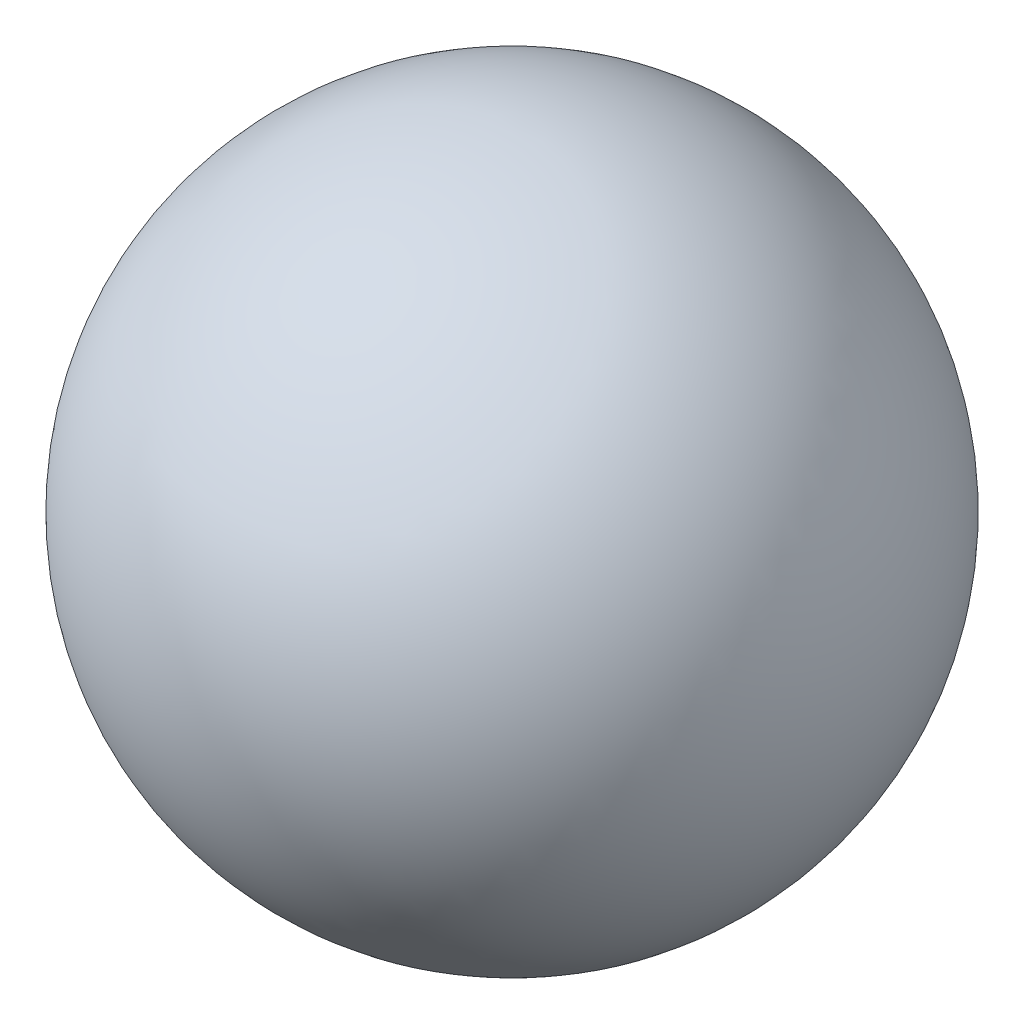
ISO-10303-21;
HEADER;
FILE_DESCRIPTION(('STEP AP214'),'2;1');
FILE_NAME('part.step','',(''),(''),'','','');
FILE_SCHEMA(('AUTOMOTIVE_DESIGN { 1 0 10303 214 1 1 1 1 }'));
ENDSEC;
DATA;
#1=APPLICATION_CONTEXT('core data for automotive mechanical design processes');
#2=APPLICATION_PROTOCOL_DEFINITION('international standard','automotive_design',2000,#1);
#3=PRODUCT_CONTEXT('',#1,'mechanical');
#4=PRODUCT('Part','Part','',(#3));
#5=PRODUCT_RELATED_PRODUCT_CATEGORY('part','',(#4));
#6=PRODUCT_DEFINITION_FORMATION('','',#4);
#7=PRODUCT_DEFINITION_CONTEXT('part definition',#1,'design');
#8=PRODUCT_DEFINITION('design','',#6,#7);
#9=PRODUCT_DEFINITION_SHAPE('','',#8);
#10=(LENGTH_UNIT() NAMED_UNIT(*) SI_UNIT(.MILLI.,.METRE.));
#11=(NAMED_UNIT(*) PLANE_ANGLE_UNIT() SI_UNIT($,.RADIAN.));
#12=(NAMED_UNIT(*) SI_UNIT($,.STERADIAN.) SOLID_ANGLE_UNIT());
#13=UNCERTAINTY_MEASURE_WITH_UNIT(LENGTH_MEASURE(1.E-05),#10,'distance_accuracy_value','');
#14=(GEOMETRIC_REPRESENTATION_CONTEXT(3) GLOBAL_UNCERTAINTY_ASSIGNED_CONTEXT((#13)) GLOBAL_UNIT_ASSIGNED_CONTEXT((#10,
#11,#12)) REPRESENTATION_CONTEXT('',''));
#15=CARTESIAN_POINT('',(0.,0.,0.));
#16=DIRECTION('',(0.,0.,1.));
#17=DIRECTION('',(1.,0.,0.));
#18=AXIS2_PLACEMENT_3D('',#15,#16,#17);
#19=CARTESIAN_POINT('',(0.,0.,0.));
#20=DIRECTION('',(0.,1.,0.));
#21=DIRECTION('',(1.,0.,0.));
#22=AXIS2_PLACEMENT_3D('',#19,#20,#21);
#23=SPHERICAL_SURFACE('',#22,70.);
#24=CARTESIAN_POINT('',(0.,70.,0.));
#25=VERTEX_POINT('',#24);
#26=VERTEX_LOOP('',#25);
#27=FACE_BOUND('',#26,.T.);
#28=ADVANCED_FACE('F30',(#27),#23,.T.);
#29=CLOSED_SHELL('',(#28));
#30=MANIFOLD_SOLID_BREP('B2',#29);
#31=ADVANCED_BREP_SHAPE_REPRESENTATION('',(#18,#30),#14);
#32=SHAPE_DEFINITION_REPRESENTATION(#9,#31);
ENDSEC;
END-ISO-10303-21;
